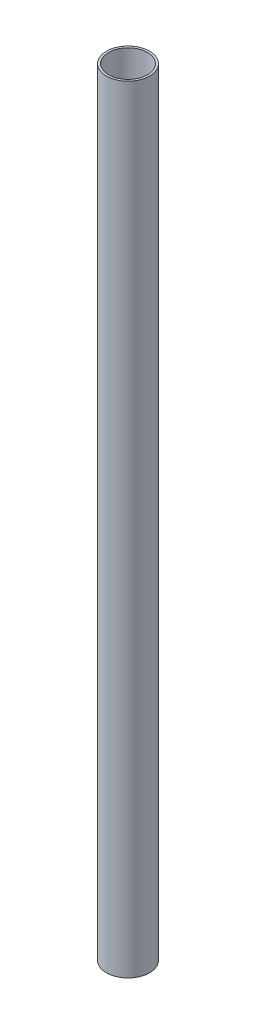
ISO-10303-21;
HEADER;
FILE_DESCRIPTION(('STEP AP214'),'2;1');
FILE_NAME('part.step','',(''),(''),'','','');
FILE_SCHEMA(('AUTOMOTIVE_DESIGN { 1 0 10303 214 1 1 1 1 }'));
ENDSEC;
DATA;
#1=APPLICATION_CONTEXT('core data for automotive mechanical design processes');
#2=APPLICATION_PROTOCOL_DEFINITION('international standard','automotive_design',2000,#1);
#3=PRODUCT_CONTEXT('',#1,'mechanical');
#4=PRODUCT('Part','Part','',(#3));
#5=PRODUCT_RELATED_PRODUCT_CATEGORY('part','',(#4));
#6=PRODUCT_DEFINITION_FORMATION('','',#4);
#7=PRODUCT_DEFINITION_CONTEXT('part definition',#1,'design');
#8=PRODUCT_DEFINITION('design','',#6,#7);
#9=PRODUCT_DEFINITION_SHAPE('','',#8);
#10=(LENGTH_UNIT() NAMED_UNIT(*) SI_UNIT(.MILLI.,.METRE.));
#11=(NAMED_UNIT(*) PLANE_ANGLE_UNIT() SI_UNIT($,.RADIAN.));
#12=(NAMED_UNIT(*) SI_UNIT($,.STERADIAN.) SOLID_ANGLE_UNIT());
#13=UNCERTAINTY_MEASURE_WITH_UNIT(LENGTH_MEASURE(1.E-05),#10,'distance_accuracy_value','');
#14=(GEOMETRIC_REPRESENTATION_CONTEXT(3) GLOBAL_UNCERTAINTY_ASSIGNED_CONTEXT((#13)) GLOBAL_UNIT_ASSIGNED_CONTEXT((#10,
#11,#12)) REPRESENTATION_CONTEXT('',''));
#15=CARTESIAN_POINT('',(0.,0.,0.));
#16=DIRECTION('',(0.,0.,1.));
#17=DIRECTION('',(1.,0.,0.));
#18=AXIS2_PLACEMENT_3D('',#15,#16,#17);
#19=CARTESIAN_POINT('',(0.,180.,0.));
#20=DIRECTION('',(0.,1.,0.));
#21=DIRECTION('',(0.,0.,1.));
#22=AXIS2_PLACEMENT_3D('',#19,#20,#21);
#23=PLANE('',#22);
#24=CARTESIAN_POINT('',(0.,180.,0.));
#25=DIRECTION('',(0.,1.,0.));
#26=DIRECTION('',(0.,0.,1.));
#27=AXIS2_PLACEMENT_3D('',#24,#25,#26);
#28=CIRCLE('',#27,10.);
#29=CARTESIAN_POINT('',(0.,180.,-10.));
#30=VERTEX_POINT('',#29);
#31=EDGE_CURVE('E11',#30,#30,#28,.T.);
#32=ORIENTED_EDGE('',*,*,#31,.T.);
#33=EDGE_LOOP('',(#32));
#34=FACE_BOUND('',#33,.T.);
#35=CARTESIAN_POINT('',(0.,180.,0.));
#36=DIRECTION('',(0.,1.,0.));
#37=DIRECTION('',(1.,0.,0.));
#38=AXIS2_PLACEMENT_3D('',#35,#36,#37);
#39=CIRCLE('',#38,9.);
#40=CARTESIAN_POINT('',(0.,180.,-9.));
#41=VERTEX_POINT('',#40);
#42=EDGE_CURVE('E50',#41,#41,#39,.T.);
#43=ORIENTED_EDGE('',*,*,#42,.F.);
#44=EDGE_LOOP('',(#43));
#45=FACE_BOUND('',#44,.T.);
#46=ADVANCED_FACE('F39',(#34,#45),#23,.T.);
#47=CARTESIAN_POINT('',(0.,-180.,0.));
#48=DIRECTION('',(0.,1.,0.));
#49=DIRECTION('',(0.,0.,1.));
#50=AXIS2_PLACEMENT_3D('',#47,#48,#49);
#51=PLANE('',#50);
#52=CARTESIAN_POINT('',(0.,-180.,0.));
#53=DIRECTION('',(0.,1.,0.));
#54=DIRECTION('',(0.,0.,1.));
#55=AXIS2_PLACEMENT_3D('',#52,#53,#54);
#56=CIRCLE('',#55,10.);
#57=CARTESIAN_POINT('',(0.,-180.,-10.));
#58=VERTEX_POINT('',#57);
#59=EDGE_CURVE('E43',#58,#58,#56,.T.);
#60=ORIENTED_EDGE('',*,*,#59,.F.);
#61=EDGE_LOOP('',(#60));
#62=FACE_BOUND('',#61,.T.);
#63=CARTESIAN_POINT('',(0.,-180.,0.));
#64=DIRECTION('',(0.,1.,0.));
#65=DIRECTION('',(1.,0.,0.));
#66=AXIS2_PLACEMENT_3D('',#63,#64,#65);
#67=CIRCLE('',#66,9.);
#68=CARTESIAN_POINT('',(0.,-180.,-9.));
#69=VERTEX_POINT('',#68);
#70=EDGE_CURVE('E52',#69,#69,#67,.T.);
#71=ORIENTED_EDGE('',*,*,#70,.T.);
#72=EDGE_LOOP('',(#71));
#73=FACE_BOUND('',#72,.T.);
#74=ADVANCED_FACE('F62',(#62,#73),#51,.F.);
#75=CARTESIAN_POINT('',(0.,180.,0.));
#76=DIRECTION('',(0.,-1.,0.));
#77=DIRECTION('',(0.,0.,-1.));
#78=AXIS2_PLACEMENT_3D('',#75,#76,#77);
#79=CYLINDRICAL_SURFACE('',#78,10.);
#80=CARTESIAN_POINT('',(0.,180.,-10.));
#81=CARTESIAN_POINT('',(0.,176.25,-10.));
#82=CARTESIAN_POINT('',(0.,172.5,-10.));
#83=CARTESIAN_POINT('',(0.,165.,-10.));
#84=CARTESIAN_POINT('',(0.,161.25,-10.));
#85=CARTESIAN_POINT('',(0.,153.75,-10.));
#86=CARTESIAN_POINT('',(0.,150.,-10.));
#87=CARTESIAN_POINT('',(0.,142.5,-10.));
#88=CARTESIAN_POINT('',(0.,138.75,-10.));
#89=CARTESIAN_POINT('',(0.,131.25,-10.));
#90=CARTESIAN_POINT('',(0.,127.5,-10.));
#91=CARTESIAN_POINT('',(0.,120.,-10.));
#92=CARTESIAN_POINT('',(0.,116.25,-10.));
#93=CARTESIAN_POINT('',(0.,108.75,-10.));
#94=CARTESIAN_POINT('',(0.,105.,-10.));
#95=CARTESIAN_POINT('',(0.,97.5,-10.));
#96=CARTESIAN_POINT('',(0.,93.75,-10.));
#97=CARTESIAN_POINT('',(0.,86.25,-10.));
#98=CARTESIAN_POINT('',(0.,82.5,-10.));
#99=CARTESIAN_POINT('',(0.,75.,-10.));
#100=CARTESIAN_POINT('',(0.,71.25,-10.));
#101=CARTESIAN_POINT('',(0.,63.75,-10.));
#102=CARTESIAN_POINT('',(0.,60.,-10.));
#103=CARTESIAN_POINT('',(0.,52.5,-10.));
#104=CARTESIAN_POINT('',(0.,48.75,-10.));
#105=CARTESIAN_POINT('',(0.,41.25,-10.));
#106=CARTESIAN_POINT('',(0.,37.5,-10.));
#107=CARTESIAN_POINT('',(0.,30.,-10.));
#108=CARTESIAN_POINT('',(0.,26.25,-10.));
#109=CARTESIAN_POINT('',(0.,18.75,-10.));
#110=CARTESIAN_POINT('',(0.,15.,-10.));
#111=CARTESIAN_POINT('',(0.,7.49999999999998,-10.));
#112=CARTESIAN_POINT('',(0.,3.74999999999998,-10.));
#113=CARTESIAN_POINT('',(0.,-3.75000000000003,-10.));
#114=CARTESIAN_POINT('',(0.,-7.50000000000003,-10.));
#115=CARTESIAN_POINT('',(0.,-15.,-10.));
#116=CARTESIAN_POINT('',(0.,-18.75,-10.));
#117=CARTESIAN_POINT('',(0.,-26.25,-10.));
#118=CARTESIAN_POINT('',(0.,-30.,-10.));
#119=CARTESIAN_POINT('',(0.,-37.5,-10.));
#120=CARTESIAN_POINT('',(0.,-41.25,-10.));
#121=CARTESIAN_POINT('',(0.,-48.75,-10.));
#122=CARTESIAN_POINT('',(0.,-52.5,-10.));
#123=CARTESIAN_POINT('',(0.,-60.,-10.));
#124=CARTESIAN_POINT('',(0.,-63.75,-10.));
#125=CARTESIAN_POINT('',(0.,-71.25,-10.));
#126=CARTESIAN_POINT('',(0.,-75.,-10.));
#127=CARTESIAN_POINT('',(0.,-82.5,-10.));
#128=CARTESIAN_POINT('',(0.,-86.25,-10.));
#129=CARTESIAN_POINT('',(0.,-93.75,-10.));
#130=CARTESIAN_POINT('',(0.,-97.5,-10.));
#131=CARTESIAN_POINT('',(0.,-105.,-10.));
#132=CARTESIAN_POINT('',(0.,-108.75,-10.));
#133=CARTESIAN_POINT('',(0.,-116.25,-10.));
#134=CARTESIAN_POINT('',(0.,-120.,-10.));
#135=CARTESIAN_POINT('',(0.,-127.5,-10.));
#136=CARTESIAN_POINT('',(0.,-131.25,-10.));
#137=CARTESIAN_POINT('',(0.,-138.75,-10.));
#138=CARTESIAN_POINT('',(0.,-142.5,-10.));
#139=CARTESIAN_POINT('',(0.,-150.,-10.));
#140=CARTESIAN_POINT('',(0.,-153.75,-10.));
#141=CARTESIAN_POINT('',(0.,-161.25,-10.));
#142=CARTESIAN_POINT('',(0.,-165.,-10.));
#143=CARTESIAN_POINT('',(0.,-172.5,-10.));
#144=CARTESIAN_POINT('',(0.,-176.25,-10.));
#145=CARTESIAN_POINT('',(0.,-180.,-10.));
#146=B_SPLINE_CURVE_WITH_KNOTS('',3,(#80,#81,#82,#83,#84,#85,#86,#87,#88,#89,#90,#91,#92,#93,
#94,#95,#96,#97,#98,#99,#100,#101,#102,#103,#104,#105,#106,#107,#108,#109,#110,#111,#112,#113,
#114,#115,#116,#117,#118,#119,#120,#121,#122,#123,#124,#125,#126,#127,#128,#129,#130,#131,#132,
#133,#134,#135,#136,#137,#138,#139,#140,#141,#142,#143,#144,#145),.UNSPECIFIED.,.F.,.F.,(4,2,2,
2,2,2,2,2,2,2,2,2,2,2,2,2,2,2,2,2,2,2,2,2,2,2,2,2,2,2,2,2,4),(0.,11.25,22.5,33.75,45.,56.25,
67.5,78.75,90.,101.25,112.5,123.75,135.,146.25,157.5,168.75,180.,191.25,202.5,213.75,225.,
236.25,247.5,258.75,270.,281.25,292.5,303.75,315.,326.25,337.5,348.75,360.),.UNSPECIFIED.);
#147=EDGE_CURVE('BSEAM41',#30,#58,#146,.T.);
#148=ORIENTED_EDGE('',*,*,#31,.F.);
#149=ORIENTED_EDGE('',*,*,#59,.T.);
#150=ORIENTED_EDGE('',*,*,#147,.T.);
#151=ORIENTED_EDGE('',*,*,#147,.F.);
#152=EDGE_LOOP('',(#148,#150,#149,#151));
#153=FACE_BOUND('',#152,.T.);
#154=ADVANCED_FACE('F41',(#153),#79,.T.);
#155=CARTESIAN_POINT('',(0.,180.,0.));
#156=DIRECTION('',(0.,-1.,0.));
#157=DIRECTION('',(0.,0.,-1.));
#158=AXIS2_PLACEMENT_3D('',#155,#156,#157);
#159=CYLINDRICAL_SURFACE('',#158,9.);
#160=CARTESIAN_POINT('',(0.,180.,-9.));
#161=CARTESIAN_POINT('',(0.,176.25,-9.));
#162=CARTESIAN_POINT('',(0.,172.5,-9.));
#163=CARTESIAN_POINT('',(0.,165.,-9.));
#164=CARTESIAN_POINT('',(0.,161.25,-9.));
#165=CARTESIAN_POINT('',(0.,153.75,-9.));
#166=CARTESIAN_POINT('',(0.,150.,-9.));
#167=CARTESIAN_POINT('',(0.,142.5,-9.));
#168=CARTESIAN_POINT('',(0.,138.75,-9.));
#169=CARTESIAN_POINT('',(0.,131.25,-9.));
#170=CARTESIAN_POINT('',(0.,127.5,-9.));
#171=CARTESIAN_POINT('',(0.,120.,-9.));
#172=CARTESIAN_POINT('',(0.,116.25,-9.));
#173=CARTESIAN_POINT('',(0.,108.75,-9.));
#174=CARTESIAN_POINT('',(0.,105.,-9.));
#175=CARTESIAN_POINT('',(0.,97.5,-9.));
#176=CARTESIAN_POINT('',(0.,93.75,-9.));
#177=CARTESIAN_POINT('',(0.,86.25,-9.));
#178=CARTESIAN_POINT('',(0.,82.5,-9.));
#179=CARTESIAN_POINT('',(0.,75.,-9.));
#180=CARTESIAN_POINT('',(0.,71.25,-9.));
#181=CARTESIAN_POINT('',(0.,63.75,-9.));
#182=CARTESIAN_POINT('',(0.,60.,-9.));
#183=CARTESIAN_POINT('',(0.,52.5,-9.));
#184=CARTESIAN_POINT('',(0.,48.75,-9.));
#185=CARTESIAN_POINT('',(0.,41.25,-9.));
#186=CARTESIAN_POINT('',(0.,37.5,-9.));
#187=CARTESIAN_POINT('',(0.,30.,-9.));
#188=CARTESIAN_POINT('',(0.,26.25,-9.));
#189=CARTESIAN_POINT('',(0.,18.75,-9.));
#190=CARTESIAN_POINT('',(0.,15.,-9.));
#191=CARTESIAN_POINT('',(0.,7.49999999999998,-9.));
#192=CARTESIAN_POINT('',(0.,3.74999999999998,-9.));
#193=CARTESIAN_POINT('',(0.,-3.75000000000003,-9.));
#194=CARTESIAN_POINT('',(0.,-7.50000000000003,-9.));
#195=CARTESIAN_POINT('',(0.,-15.,-9.));
#196=CARTESIAN_POINT('',(0.,-18.75,-9.));
#197=CARTESIAN_POINT('',(0.,-26.25,-9.));
#198=CARTESIAN_POINT('',(0.,-30.,-9.));
#199=CARTESIAN_POINT('',(0.,-37.5,-9.));
#200=CARTESIAN_POINT('',(0.,-41.25,-9.));
#201=CARTESIAN_POINT('',(0.,-48.75,-9.));
#202=CARTESIAN_POINT('',(0.,-52.5,-9.));
#203=CARTESIAN_POINT('',(0.,-60.,-9.));
#204=CARTESIAN_POINT('',(0.,-63.75,-9.));
#205=CARTESIAN_POINT('',(0.,-71.25,-9.));
#206=CARTESIAN_POINT('',(0.,-75.,-9.));
#207=CARTESIAN_POINT('',(0.,-82.5,-9.));
#208=CARTESIAN_POINT('',(0.,-86.25,-9.));
#209=CARTESIAN_POINT('',(0.,-93.75,-9.));
#210=CARTESIAN_POINT('',(0.,-97.5,-9.));
#211=CARTESIAN_POINT('',(0.,-105.,-9.));
#212=CARTESIAN_POINT('',(0.,-108.75,-9.));
#213=CARTESIAN_POINT('',(0.,-116.25,-9.));
#214=CARTESIAN_POINT('',(0.,-120.,-9.));
#215=CARTESIAN_POINT('',(0.,-127.5,-9.));
#216=CARTESIAN_POINT('',(0.,-131.25,-9.));
#217=CARTESIAN_POINT('',(0.,-138.75,-9.));
#218=CARTESIAN_POINT('',(0.,-142.5,-9.));
#219=CARTESIAN_POINT('',(0.,-150.,-9.));
#220=CARTESIAN_POINT('',(0.,-153.75,-9.));
#221=CARTESIAN_POINT('',(0.,-161.25,-9.));
#222=CARTESIAN_POINT('',(0.,-165.,-9.));
#223=CARTESIAN_POINT('',(0.,-172.5,-9.));
#224=CARTESIAN_POINT('',(0.,-176.25,-9.));
#225=CARTESIAN_POINT('',(0.,-180.,-9.));
#226=B_SPLINE_CURVE_WITH_KNOTS('',3,(#160,#161,#162,#163,#164,#165,#166,#167,#168,#169,#170,
#171,#172,#173,#174,#175,#176,#177,#178,#179,#180,#181,#182,#183,#184,#185,#186,#187,#188,#189,
#190,#191,#192,#193,#194,#195,#196,#197,#198,#199,#200,#201,#202,#203,#204,#205,#206,#207,#208,
#209,#210,#211,#212,#213,#214,#215,#216,#217,#218,#219,#220,#221,#222,#223,#224,#225),
.UNSPECIFIED.,.F.,.F.,(4,2,2,2,2,2,2,2,2,2,2,2,2,2,2,2,2,2,2,2,2,2,2,2,2,2,2,2,2,2,2,2,4),(0.,
11.25,22.5,33.75,45.,56.25,67.5,78.75,90.,101.25,112.5,123.75,135.,146.25,157.5,168.75,180.,
191.25,202.5,213.75,225.,236.25,247.5,258.75,270.,281.25,292.5,303.75,315.,326.25,337.5,348.75,
360.),.UNSPECIFIED.);
#227=EDGE_CURVE('BSEAM58',#41,#69,#226,.T.);
#228=ORIENTED_EDGE('',*,*,#42,.T.);
#229=ORIENTED_EDGE('',*,*,#70,.F.);
#230=ORIENTED_EDGE('',*,*,#227,.T.);
#231=ORIENTED_EDGE('',*,*,#227,.F.);
#232=EDGE_LOOP('',(#228,#230,#229,#231));
#233=FACE_BOUND('',#232,.T.);
#234=ADVANCED_FACE('F58',(#233),#159,.F.);
#235=CLOSED_SHELL('',(#46,#74,#154,#234));
#236=MANIFOLD_SOLID_BREP('B2',#235);
#237=ADVANCED_BREP_SHAPE_REPRESENTATION('',(#18,#236),#14);
#238=SHAPE_DEFINITION_REPRESENTATION(#9,#237);
ENDSEC;
END-ISO-10303-21;
